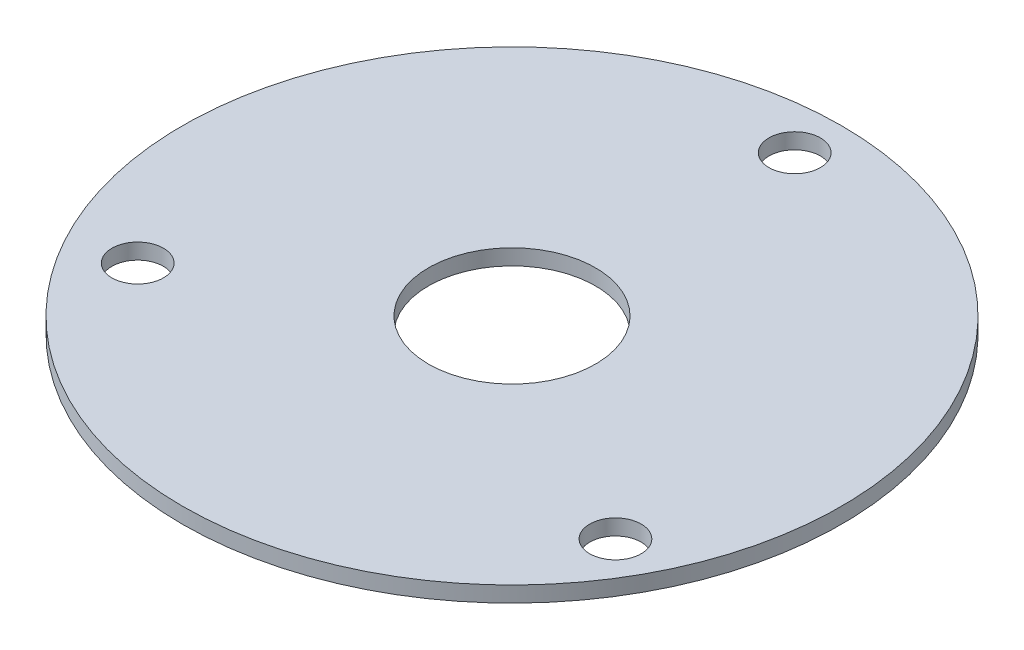
ISO-10303-21;
HEADER;
FILE_DESCRIPTION(('STEP AP214'),'2;1');
FILE_NAME('part.step','',(''),(''),'','','');
FILE_SCHEMA(('AUTOMOTIVE_DESIGN { 1 0 10303 214 1 1 1 1 }'));
ENDSEC;
DATA;
#1=APPLICATION_CONTEXT('core data for automotive mechanical design processes');
#2=APPLICATION_PROTOCOL_DEFINITION('international standard','automotive_design',2000,#1);
#3=PRODUCT_CONTEXT('',#1,'mechanical');
#4=PRODUCT('Part','Part','',(#3));
#5=PRODUCT_RELATED_PRODUCT_CATEGORY('part','',(#4));
#6=PRODUCT_DEFINITION_FORMATION('','',#4);
#7=PRODUCT_DEFINITION_CONTEXT('part definition',#1,'design');
#8=PRODUCT_DEFINITION('design','',#6,#7);
#9=PRODUCT_DEFINITION_SHAPE('','',#8);
#10=(LENGTH_UNIT() NAMED_UNIT(*) SI_UNIT(.MILLI.,.METRE.));
#11=(NAMED_UNIT(*) PLANE_ANGLE_UNIT() SI_UNIT($,.RADIAN.));
#12=(NAMED_UNIT(*) SI_UNIT($,.STERADIAN.) SOLID_ANGLE_UNIT());
#13=UNCERTAINTY_MEASURE_WITH_UNIT(LENGTH_MEASURE(1.E-05),#10,'distance_accuracy_value','');
#14=(GEOMETRIC_REPRESENTATION_CONTEXT(3) GLOBAL_UNCERTAINTY_ASSIGNED_CONTEXT((#13)) GLOBAL_UNIT_ASSIGNED_CONTEXT((#10,
#11,#12)) REPRESENTATION_CONTEXT('',''));
#15=CARTESIAN_POINT('',(0.,0.,0.));
#16=DIRECTION('',(0.,0.,1.));
#17=DIRECTION('',(1.,0.,0.));
#18=AXIS2_PLACEMENT_3D('',#15,#16,#17);
#19=CARTESIAN_POINT('',(0.,2.5,0.));
#20=DIRECTION('',(0.,1.,0.));
#21=DIRECTION('',(0.,0.,1.));
#22=AXIS2_PLACEMENT_3D('',#19,#20,#21);
#23=PLANE('',#22);
#24=CARTESIAN_POINT('',(0.,2.5,-45.0333209967901));
#25=DIRECTION('',(0.,1.,0.));
#26=DIRECTION('',(0.,0.,1.));
#27=AXIS2_PLACEMENT_3D('',#24,#25,#26);
#28=CIRCLE('',#27,4.1);
#29=CARTESIAN_POINT('',(0.,2.5,-40.9333209967901));
#30=VERTEX_POINT('',#29);
#31=EDGE_CURVE('E66',#30,#30,#28,.T.);
#32=ORIENTED_EDGE('',*,*,#31,.F.);
#33=EDGE_LOOP('',(#32));
#34=FACE_BOUND('',#33,.T.);
#35=CARTESIAN_POINT('',(38.9999999999997,2.5,22.516660498396));
#36=DIRECTION('',(0.,1.,0.));
#37=DIRECTION('',(0.,0.,1.));
#38=AXIS2_PLACEMENT_3D('',#35,#36,#37);
#39=CIRCLE('',#38,4.1);
#40=CARTESIAN_POINT('',(38.9999999999997,2.5,26.616660498396));
#41=VERTEX_POINT('',#40);
#42=EDGE_CURVE('E63',#41,#41,#39,.T.);
#43=ORIENTED_EDGE('',*,*,#42,.F.);
#44=EDGE_LOOP('',(#43));
#45=FACE_BOUND('',#44,.T.);
#46=CARTESIAN_POINT('',(-37.1138661692879,2.5,22.5166604983954));
#47=DIRECTION('',(0.,1.,0.));
#48=DIRECTION('',(0.,0.,1.));
#49=AXIS2_PLACEMENT_3D('',#46,#47,#48);
#50=CIRCLE('',#49,4.1);
#51=CARTESIAN_POINT('',(-37.1138661692879,2.5,26.6166604983954));
#52=VERTEX_POINT('',#51);
#53=EDGE_CURVE('E57',#52,#52,#50,.T.);
#54=ORIENTED_EDGE('',*,*,#53,.F.);
#55=EDGE_LOOP('',(#54));
#56=FACE_BOUND('',#55,.T.);
#57=CARTESIAN_POINT('',(0.,2.5,0.));
#58=DIRECTION('',(0.,1.,0.));
#59=DIRECTION('',(0.,0.,1.));
#60=AXIS2_PLACEMENT_3D('',#57,#58,#59);
#61=CIRCLE('',#60,52.5);
#62=CARTESIAN_POINT('',(0.,2.5,52.5));
#63=VERTEX_POINT('',#62);
#64=EDGE_CURVE('E10',#63,#63,#61,.T.);
#65=ORIENTED_EDGE('',*,*,#64,.T.);
#66=EDGE_LOOP('',(#65));
#67=FACE_BOUND('',#66,.T.);
#68=CARTESIAN_POINT('',(0.,2.5,0.));
#69=DIRECTION('',(0.,1.,0.));
#70=DIRECTION('',(0.,0.,1.));
#71=AXIS2_PLACEMENT_3D('',#68,#69,#70);
#72=CIRCLE('',#71,13.3);
#73=CARTESIAN_POINT('',(0.,2.5,13.3));
#74=VERTEX_POINT('',#73);
#75=EDGE_CURVE('E46',#74,#74,#72,.T.);
#76=ORIENTED_EDGE('',*,*,#75,.F.);
#77=EDGE_LOOP('',(#76));
#78=FACE_BOUND('',#77,.T.);
#79=ADVANCED_FACE('F35',(#34,#45,#56,#67,#78),#23,.T.);
#80=CARTESIAN_POINT('',(0.,0.,0.));
#81=DIRECTION('',(0.,1.,0.));
#82=DIRECTION('',(0.,0.,1.));
#83=AXIS2_PLACEMENT_3D('',#80,#81,#82);
#84=PLANE('',#83);
#85=CARTESIAN_POINT('',(0.,0.,-45.0333209967901));
#86=DIRECTION('',(0.,1.,0.));
#87=DIRECTION('',(0.,0.,1.));
#88=AXIS2_PLACEMENT_3D('',#85,#86,#87);
#89=CIRCLE('',#88,4.1);
#90=CARTESIAN_POINT('',(0.,0.,-40.9333209967901));
#91=VERTEX_POINT('',#90);
#92=EDGE_CURVE('E51',#91,#91,#89,.T.);
#93=ORIENTED_EDGE('',*,*,#92,.T.);
#94=EDGE_LOOP('',(#93));
#95=FACE_BOUND('',#94,.T.);
#96=CARTESIAN_POINT('',(38.9999999999997,0.,22.516660498396));
#97=DIRECTION('',(0.,1.,0.));
#98=DIRECTION('',(0.,0.,1.));
#99=AXIS2_PLACEMENT_3D('',#96,#97,#98);
#100=CIRCLE('',#99,4.1);
#101=CARTESIAN_POINT('',(38.9999999999997,0.,26.616660498396));
#102=VERTEX_POINT('',#101);
#103=EDGE_CURVE('E60',#102,#102,#100,.T.);
#104=ORIENTED_EDGE('',*,*,#103,.T.);
#105=EDGE_LOOP('',(#104));
#106=FACE_BOUND('',#105,.T.);
#107=CARTESIAN_POINT('',(-37.1138661692879,0.,22.5166604983954));
#108=DIRECTION('',(0.,1.,0.));
#109=DIRECTION('',(0.,0.,1.));
#110=AXIS2_PLACEMENT_3D('',#107,#108,#109);
#111=CIRCLE('',#110,4.1);
#112=CARTESIAN_POINT('',(-37.1138661692879,0.,26.6166604983954));
#113=VERTEX_POINT('',#112);
#114=EDGE_CURVE('E54',#113,#113,#111,.T.);
#115=ORIENTED_EDGE('',*,*,#114,.T.);
#116=EDGE_LOOP('',(#115));
#117=FACE_BOUND('',#116,.T.);
#118=CARTESIAN_POINT('',(0.,0.,0.));
#119=DIRECTION('',(0.,1.,0.));
#120=DIRECTION('',(0.,0.,1.));
#121=AXIS2_PLACEMENT_3D('',#118,#119,#120);
#122=CIRCLE('',#121,52.5);
#123=CARTESIAN_POINT('',(0.,0.,52.5));
#124=VERTEX_POINT('',#123);
#125=EDGE_CURVE('E39',#124,#124,#122,.T.);
#126=ORIENTED_EDGE('',*,*,#125,.F.);
#127=EDGE_LOOP('',(#126));
#128=FACE_BOUND('',#127,.T.);
#129=CARTESIAN_POINT('',(0.,0.,0.));
#130=DIRECTION('',(0.,1.,0.));
#131=DIRECTION('',(0.,0.,1.));
#132=AXIS2_PLACEMENT_3D('',#129,#130,#131);
#133=CIRCLE('',#132,13.3);
#134=CARTESIAN_POINT('',(0.,0.,13.3));
#135=VERTEX_POINT('',#134);
#136=EDGE_CURVE('E48',#135,#135,#133,.T.);
#137=ORIENTED_EDGE('',*,*,#136,.T.);
#138=EDGE_LOOP('',(#137));
#139=FACE_BOUND('',#138,.T.);
#140=ADVANCED_FACE('F72',(#95,#106,#117,#128,#139),#84,.F.);
#141=CARTESIAN_POINT('',(0.,2.5,0.));
#142=DIRECTION('',(0.,-1.,0.));
#143=DIRECTION('',(0.,0.,-1.));
#144=AXIS2_PLACEMENT_3D('',#141,#142,#143);
#145=CYLINDRICAL_SURFACE('',#144,52.5);
#146=ORIENTED_EDGE('',*,*,#64,.F.);
#147=EDGE_LOOP('',(#146));
#148=FACE_BOUND('',#147,.T.);
#149=ORIENTED_EDGE('',*,*,#125,.T.);
#150=EDGE_LOOP('',(#149));
#151=FACE_BOUND('',#150,.T.);
#152=ADVANCED_FACE('F37',(#148,#151),#145,.T.);
#153=CARTESIAN_POINT('',(0.,2.5,0.));
#154=DIRECTION('',(0.,-1.,0.));
#155=DIRECTION('',(0.,0.,-1.));
#156=AXIS2_PLACEMENT_3D('',#153,#154,#155);
#157=CYLINDRICAL_SURFACE('',#156,13.3);
#158=ORIENTED_EDGE('',*,*,#75,.T.);
#159=EDGE_LOOP('',(#158));
#160=FACE_BOUND('',#159,.T.);
#161=ORIENTED_EDGE('',*,*,#136,.F.);
#162=EDGE_LOOP('',(#161));
#163=FACE_BOUND('',#162,.T.);
#164=ADVANCED_FACE('F91',(#160,#163),#157,.F.);
#165=CARTESIAN_POINT('',(-37.1138661692879,0.,22.5166604983954));
#166=DIRECTION('',(0.,1.,0.));
#167=DIRECTION('',(0.,0.,1.));
#168=AXIS2_PLACEMENT_3D('',#165,#166,#167);
#169=CYLINDRICAL_SURFACE('',#168,4.1);
#170=ORIENTED_EDGE('',*,*,#114,.F.);
#171=EDGE_LOOP('',(#170));
#172=FACE_BOUND('',#171,.T.);
#173=ORIENTED_EDGE('',*,*,#53,.T.);
#174=EDGE_LOOP('',(#173));
#175=FACE_BOUND('',#174,.T.);
#176=ADVANCED_FACE('F94',(#172,#175),#169,.F.);
#177=CARTESIAN_POINT('',(38.9999999999997,0.,22.516660498396));
#178=DIRECTION('',(0.,1.,0.));
#179=DIRECTION('',(0.,0.,1.));
#180=AXIS2_PLACEMENT_3D('',#177,#178,#179);
#181=CYLINDRICAL_SURFACE('',#180,4.1);
#182=ORIENTED_EDGE('',*,*,#103,.F.);
#183=EDGE_LOOP('',(#182));
#184=FACE_BOUND('',#183,.T.);
#185=ORIENTED_EDGE('',*,*,#42,.T.);
#186=EDGE_LOOP('',(#185));
#187=FACE_BOUND('',#186,.T.);
#188=ADVANCED_FACE('F78',(#184,#187),#181,.F.);
#189=CARTESIAN_POINT('',(0.,0.,-45.0333209967901));
#190=DIRECTION('',(0.,1.,0.));
#191=DIRECTION('',(0.,0.,1.));
#192=AXIS2_PLACEMENT_3D('',#189,#190,#191);
#193=CYLINDRICAL_SURFACE('',#192,4.1);
#194=ORIENTED_EDGE('',*,*,#92,.F.);
#195=EDGE_LOOP('',(#194));
#196=FACE_BOUND('',#195,.T.);
#197=ORIENTED_EDGE('',*,*,#31,.T.);
#198=EDGE_LOOP('',(#197));
#199=FACE_BOUND('',#198,.T.);
#200=ADVANCED_FACE('F75',(#196,#199),#193,.F.);
#201=CLOSED_SHELL('',(#79,#140,#152,#164,#176,#188,#200));
#202=MANIFOLD_SOLID_BREP('B2',#201);
#203=ADVANCED_BREP_SHAPE_REPRESENTATION('',(#18,#202),#14);
#204=SHAPE_DEFINITION_REPRESENTATION(#9,#203);
ENDSEC;
END-ISO-10303-21;
